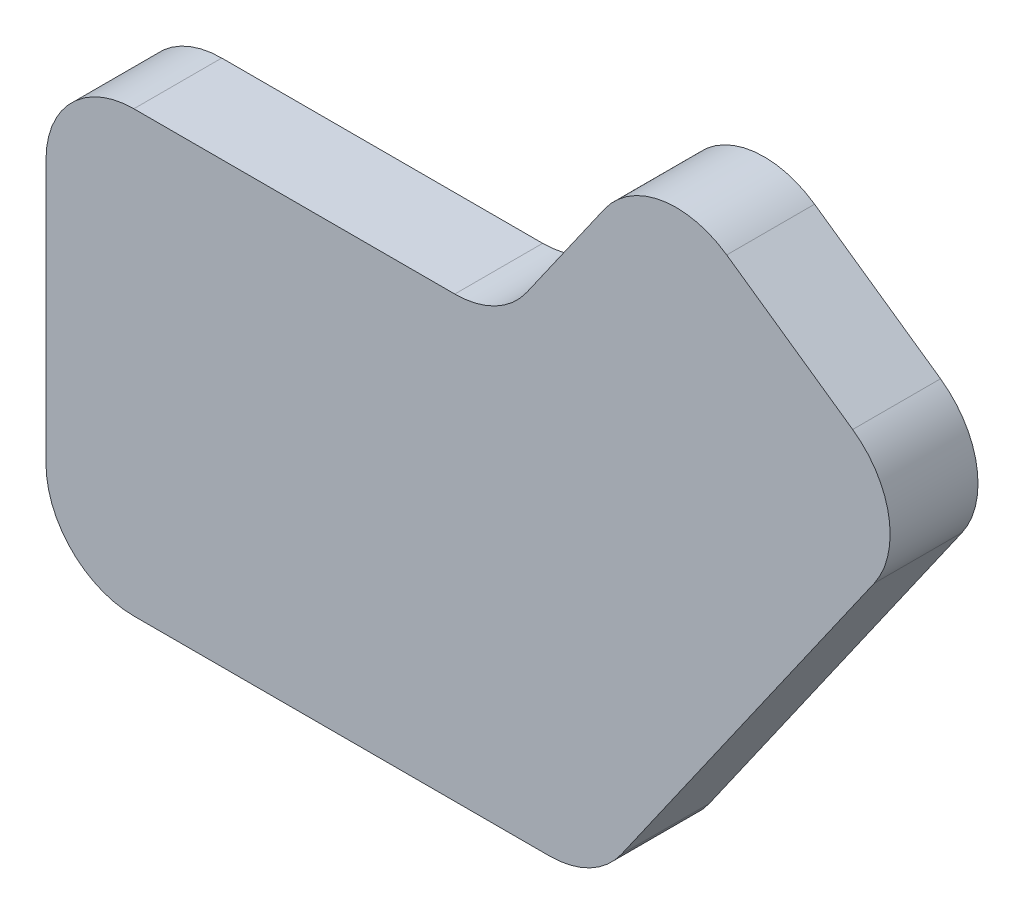
ISO-10303-21;
HEADER;
FILE_DESCRIPTION(('STEP AP214'),'2;1');
FILE_NAME('part.step','',(''),(''),'','','');
FILE_SCHEMA(('AUTOMOTIVE_DESIGN { 1 0 10303 214 1 1 1 1 }'));
ENDSEC;
DATA;
#1=APPLICATION_CONTEXT('core data for automotive mechanical design processes');
#2=APPLICATION_PROTOCOL_DEFINITION('international standard','automotive_design',2000,#1);
#3=PRODUCT_CONTEXT('',#1,'mechanical');
#4=PRODUCT('Part','Part','',(#3));
#5=PRODUCT_RELATED_PRODUCT_CATEGORY('part','',(#4));
#6=PRODUCT_DEFINITION_FORMATION('','',#4);
#7=PRODUCT_DEFINITION_CONTEXT('part definition',#1,'design');
#8=PRODUCT_DEFINITION('design','',#6,#7);
#9=PRODUCT_DEFINITION_SHAPE('','',#8);
#10=(LENGTH_UNIT() NAMED_UNIT(*) SI_UNIT(.MILLI.,.METRE.));
#11=(NAMED_UNIT(*) PLANE_ANGLE_UNIT() SI_UNIT($,.RADIAN.));
#12=(NAMED_UNIT(*) SI_UNIT($,.STERADIAN.) SOLID_ANGLE_UNIT());
#13=UNCERTAINTY_MEASURE_WITH_UNIT(LENGTH_MEASURE(1.E-05),#10,'distance_accuracy_value','');
#14=(GEOMETRIC_REPRESENTATION_CONTEXT(3) GLOBAL_UNCERTAINTY_ASSIGNED_CONTEXT((#13)) GLOBAL_UNIT_ASSIGNED_CONTEXT((#10,
#11,#12)) REPRESENTATION_CONTEXT('',''));
#15=CARTESIAN_POINT('',(0.,0.,0.));
#16=DIRECTION('',(0.,0.,1.));
#17=DIRECTION('',(1.,0.,0.));
#18=AXIS2_PLACEMENT_3D('',#15,#16,#17);
#19=CARTESIAN_POINT('',(0.,0.,20.));
#20=DIRECTION('',(-0.819152044288989,0.57357643635105,0.));
#21=DIRECTION('',(-0.57357643635105,-0.819152044288989,0.));
#22=AXIS2_PLACEMENT_3D('',#19,#20,#21);
#23=PLANE('',#22);
#24=DIRECTION('',(0.57357643635105,0.819152044288989,0.));
#25=VECTOR('',#24,1.);
#26=CARTESIAN_POINT('',(0.,0.,0.));
#27=LINE('',#26,#25);
#28=CARTESIAN_POINT('',(5.97169987474491,8.528471272979,0.));
#29=VERTEX_POINT('',#28);
#30=CARTESIAN_POINT('',(63.528471272979,90.7280596198777,0.));
#31=VERTEX_POINT('',#30);
#32=EDGE_CURVE('E210',#29,#31,#27,.T.);
#33=ORIENTED_EDGE('',*,*,#32,.T.);
#34=DIRECTION('',(0.,0.,-1.));
#35=VECTOR('',#34,1.);
#36=CARTESIAN_POINT('',(63.528471272979,90.7280596198778,20.));
#37=LINE('',#36,#35);
#38=CARTESIAN_POINT('',(63.528471272979,90.7280596198777,20.));
#39=VERTEX_POINT('',#38);
#40=EDGE_CURVE('E135',#31,#39,#37,.F.);
#41=ORIENTED_EDGE('',*,*,#40,.T.);
#42=DIRECTION('',(0.57357643635105,0.819152044288989,0.));
#43=VECTOR('',#42,1.);
#44=CARTESIAN_POINT('',(0.,0.,20.));
#45=LINE('',#44,#43);
#46=CARTESIAN_POINT('',(5.97169987474491,8.528471272979,20.));
#47=VERTEX_POINT('',#46);
#48=EDGE_CURVE('E163',#47,#39,#45,.T.);
#49=ORIENTED_EDGE('',*,*,#48,.F.);
#50=DIRECTION('',(0.,0.,-1.));
#51=VECTOR('',#50,1.);
#52=CARTESIAN_POINT('',(5.97169987474491,8.528471272979,20.));
#53=LINE('',#52,#51);
#54=EDGE_CURVE('E201',#47,#29,#53,.T.);
#55=ORIENTED_EDGE('',*,*,#54,.T.);
#56=EDGE_LOOP('',(#33,#41,#49,#55));
#57=FACE_BOUND('',#56,.T.);
#58=ADVANCED_FACE('F36',(#57),#23,.F.);
#59=CARTESIAN_POINT('',(75.,107.111100505658,20.));
#60=DIRECTION('',(-0.573576436351049,-0.81915204428899,0.));
#61=DIRECTION('',(0.81915204428899,-0.573576436351049,0.));
#62=AXIS2_PLACEMENT_3D('',#59,#60,#61);
#63=PLANE('',#62);
#64=DIRECTION('',(-0.81915204428899,0.573576436351049,0.));
#65=VECTOR('',#64,1.);
#66=CARTESIAN_POINT('',(75.,107.111100505658,0.));
#67=LINE('',#66,#65);
#68=CARTESIAN_POINT('',(58.6169591142202,118.582629232679,0.));
#69=VERTEX_POINT('',#68);
#70=CARTESIAN_POINT('',(29.9466375641056,138.657804504965,0.));
#71=VERTEX_POINT('',#70);
#72=EDGE_CURVE('E157',#69,#71,#67,.T.);
#73=ORIENTED_EDGE('',*,*,#72,.T.);
#74=DIRECTION('',(0.,0.,-1.));
#75=VECTOR('',#74,1.);
#76=CARTESIAN_POINT('',(29.9466375641056,138.657804504965,20.));
#77=LINE('',#76,#75);
#78=CARTESIAN_POINT('',(29.9466375641056,138.657804504965,20.));
#79=VERTEX_POINT('',#78);
#80=EDGE_CURVE('E51',#71,#79,#77,.F.);
#81=ORIENTED_EDGE('',*,*,#80,.T.);
#82=DIRECTION('',(-0.81915204428899,0.573576436351049,0.));
#83=VECTOR('',#82,1.);
#84=CARTESIAN_POINT('',(75.,107.111100505658,20.));
#85=LINE('',#84,#83);
#86=CARTESIAN_POINT('',(58.6169591142202,118.582629232679,20.));
#87=VERTEX_POINT('',#86);
#88=EDGE_CURVE('E216',#87,#79,#85,.T.);
#89=ORIENTED_EDGE('',*,*,#88,.F.);
#90=DIRECTION('',(0.,0.,-1.));
#91=VECTOR('',#90,1.);
#92=CARTESIAN_POINT('',(58.6169591142202,118.582629232679,20.));
#93=LINE('',#92,#91);
#94=EDGE_CURVE('E197',#87,#69,#93,.T.);
#95=ORIENTED_EDGE('',*,*,#94,.T.);
#96=EDGE_LOOP('',(#73,#81,#89,#95));
#97=FACE_BOUND('',#96,.T.);
#98=ADVANCED_FACE('F221',(#97),#63,.F.);
#99=CARTESIAN_POINT('',(13.5635966783258,150.129333231986,20.));
#100=DIRECTION('',(0.819152044288989,-0.57357643635105,0.));
#101=DIRECTION('',(0.57357643635105,0.819152044288989,0.));
#102=AXIS2_PLACEMENT_3D('',#99,#100,#101);
#103=PLANE('',#102);
#104=DIRECTION('',(-0.57357643635105,-0.819152044288989,0.));
#105=VECTOR('',#104,1.);
#106=CARTESIAN_POINT('',(13.5635966783258,150.129333231986,0.));
#107=LINE('',#106,#105);
#108=CARTESIAN_POINT('',(2.09206795130483,133.746292346206,0.));
#109=VERTEX_POINT('',#108);
#110=CARTESIAN_POINT('',(-15.5656404613929,108.528471272979,0.));
#111=VERTEX_POINT('',#110);
#112=EDGE_CURVE('E152',#109,#111,#107,.T.);
#113=ORIENTED_EDGE('',*,*,#112,.T.);
#114=DIRECTION('',(0.,0.,-1.));
#115=VECTOR('',#114,1.);
#116=CARTESIAN_POINT('',(-15.5656404613929,108.528471272979,20.));
#117=LINE('',#116,#115);
#118=CARTESIAN_POINT('',(-15.5656404613929,108.528471272979,20.));
#119=VERTEX_POINT('',#118);
#120=EDGE_CURVE('E130',#111,#119,#117,.F.);
#121=ORIENTED_EDGE('',*,*,#120,.T.);
#122=DIRECTION('',(-0.57357643635105,-0.819152044288989,0.));
#123=VECTOR('',#122,1.);
#124=CARTESIAN_POINT('',(13.5635966783258,150.129333231986,20.));
#125=LINE('',#124,#123);
#126=CARTESIAN_POINT('',(2.09206795130483,133.746292346206,20.));
#127=VERTEX_POINT('',#126);
#128=EDGE_CURVE('E228',#127,#119,#125,.T.);
#129=ORIENTED_EDGE('',*,*,#128,.F.);
#130=DIRECTION('',(0.,0.,-1.));
#131=VECTOR('',#130,1.);
#132=CARTESIAN_POINT('',(2.09206795130483,133.746292346206,20.));
#133=LINE('',#132,#131);
#134=EDGE_CURVE('E144',#127,#109,#133,.T.);
#135=ORIENTED_EDGE('',*,*,#134,.T.);
#136=EDGE_LOOP('',(#113,#121,#129,#135));
#137=FACE_BOUND('',#136,.T.);
#138=ADVANCED_FACE('F237',(#137),#103,.F.);
#139=CARTESIAN_POINT('',(-125.,100.,20.));
#140=DIRECTION('',(0.,-1.,0.));
#141=DIRECTION('',(0.,0.,-1.));
#142=AXIS2_PLACEMENT_3D('',#139,#140,#141);
#143=PLANE('',#142);
#144=DIRECTION('',(-1.,0.,0.));
#145=VECTOR('',#144,1.);
#146=CARTESIAN_POINT('',(-125.,100.,20.));
#147=LINE('',#146,#145);
#148=CARTESIAN_POINT('',(-31.9486813471727,100.,20.));
#149=VERTEX_POINT('',#148);
#150=CARTESIAN_POINT('',(-105.,100.,20.));
#151=VERTEX_POINT('',#150);
#152=EDGE_CURVE('E143',#149,#151,#147,.T.);
#153=ORIENTED_EDGE('',*,*,#152,.F.);
#154=DIRECTION('',(0.,0.,-1.));
#155=VECTOR('',#154,1.);
#156=CARTESIAN_POINT('',(-31.9486813471727,100.,0.));
#157=LINE('',#156,#155);
#158=CARTESIAN_POINT('',(-31.9486813471727,100.,0.));
#159=VERTEX_POINT('',#158);
#160=EDGE_CURVE('E129',#149,#159,#157,.T.);
#161=ORIENTED_EDGE('',*,*,#160,.T.);
#162=DIRECTION('',(-1.,0.,0.));
#163=VECTOR('',#162,1.);
#164=CARTESIAN_POINT('',(-125.,100.,0.));
#165=LINE('',#164,#163);
#166=CARTESIAN_POINT('',(-105.,100.,0.));
#167=VERTEX_POINT('',#166);
#168=EDGE_CURVE('E140',#159,#167,#165,.T.);
#169=ORIENTED_EDGE('',*,*,#168,.T.);
#170=DIRECTION('',(0.,0.,-1.));
#171=VECTOR('',#170,1.);
#172=CARTESIAN_POINT('',(-105.,100.,20.));
#173=LINE('',#172,#171);
#174=EDGE_CURVE('E145',#167,#151,#173,.F.);
#175=ORIENTED_EDGE('',*,*,#174,.T.);
#176=EDGE_LOOP('',(#153,#161,#169,#175));
#177=FACE_BOUND('',#176,.T.);
#178=ADVANCED_FACE('F139',(#177),#143,.F.);
#179=CARTESIAN_POINT('',(-125.,0.,20.));
#180=DIRECTION('',(1.,0.,0.));
#181=DIRECTION('',(0.,0.,-1.));
#182=AXIS2_PLACEMENT_3D('',#179,#180,#181);
#183=PLANE('',#182);
#184=DIRECTION('',(0.,-1.,0.));
#185=VECTOR('',#184,1.);
#186=CARTESIAN_POINT('',(-125.,0.,0.));
#187=LINE('',#186,#185);
#188=CARTESIAN_POINT('',(-125.,80.,0.));
#189=VERTEX_POINT('',#188);
#190=CARTESIAN_POINT('',(-125.,20.,0.));
#191=VERTEX_POINT('',#190);
#192=EDGE_CURVE('E151',#189,#191,#187,.T.);
#193=ORIENTED_EDGE('',*,*,#192,.T.);
#194=DIRECTION('',(0.,0.,-1.));
#195=VECTOR('',#194,1.);
#196=CARTESIAN_POINT('',(-125.,20.,20.));
#197=LINE('',#196,#195);
#198=CARTESIAN_POINT('',(-125.,20.,20.));
#199=VERTEX_POINT('',#198);
#200=EDGE_CURVE('E186',#191,#199,#197,.F.);
#201=ORIENTED_EDGE('',*,*,#200,.T.);
#202=DIRECTION('',(0.,-1.,0.));
#203=VECTOR('',#202,1.);
#204=CARTESIAN_POINT('',(-125.,0.,20.));
#205=LINE('',#204,#203);
#206=CARTESIAN_POINT('',(-125.,80.,20.));
#207=VERTEX_POINT('',#206);
#208=EDGE_CURVE('E225',#207,#199,#205,.T.);
#209=ORIENTED_EDGE('',*,*,#208,.F.);
#210=DIRECTION('',(0.,0.,-1.));
#211=VECTOR('',#210,1.);
#212=CARTESIAN_POINT('',(-125.,80.,20.));
#213=LINE('',#212,#211);
#214=EDGE_CURVE('E183',#207,#189,#213,.T.);
#215=ORIENTED_EDGE('',*,*,#214,.T.);
#216=EDGE_LOOP('',(#193,#201,#209,#215));
#217=FACE_BOUND('',#216,.T.);
#218=ADVANCED_FACE('F244',(#217),#183,.F.);
#219=CARTESIAN_POINT('',(0.,0.,20.));
#220=DIRECTION('',(0.,1.,0.));
#221=DIRECTION('',(0.,0.,1.));
#222=AXIS2_PLACEMENT_3D('',#219,#220,#221);
#223=PLANE('',#222);
#224=DIRECTION('',(1.,0.,0.));
#225=VECTOR('',#224,1.);
#226=CARTESIAN_POINT('',(0.,0.,20.));
#227=LINE('',#226,#225);
#228=CARTESIAN_POINT('',(-105.,0.,20.));
#229=VERTEX_POINT('',#228);
#230=CARTESIAN_POINT('',(-10.4113410110349,0.,20.));
#231=VERTEX_POINT('',#230);
#232=EDGE_CURVE('E164',#229,#231,#227,.T.);
#233=ORIENTED_EDGE('',*,*,#232,.F.);
#234=DIRECTION('',(0.,0.,-1.));
#235=VECTOR('',#234,1.);
#236=CARTESIAN_POINT('',(-105.,0.,20.));
#237=LINE('',#236,#235);
#238=CARTESIAN_POINT('',(-105.,0.,0.));
#239=VERTEX_POINT('',#238);
#240=EDGE_CURVE('E171',#229,#239,#237,.T.);
#241=ORIENTED_EDGE('',*,*,#240,.T.);
#242=DIRECTION('',(1.,0.,0.));
#243=VECTOR('',#242,1.);
#244=CARTESIAN_POINT('',(0.,0.,0.));
#245=LINE('',#244,#243);
#246=CARTESIAN_POINT('',(-10.4113410110349,0.,0.));
#247=VERTEX_POINT('',#246);
#248=EDGE_CURVE('E155',#239,#247,#245,.T.);
#249=ORIENTED_EDGE('',*,*,#248,.T.);
#250=DIRECTION('',(0.,0.,-1.));
#251=VECTOR('',#250,1.);
#252=CARTESIAN_POINT('',(-10.4113410110349,0.,20.));
#253=LINE('',#252,#251);
#254=EDGE_CURVE('E169',#247,#231,#253,.F.);
#255=ORIENTED_EDGE('',*,*,#254,.T.);
#256=EDGE_LOOP('',(#233,#241,#249,#255));
#257=FACE_BOUND('',#256,.T.);
#258=ADVANCED_FACE('F252',(#257),#223,.F.);
#259=CARTESIAN_POINT('',(0.,0.,20.));
#260=DIRECTION('',(0.,0.,1.));
#261=DIRECTION('',(1.,0.,0.));
#262=AXIS2_PLACEMENT_3D('',#259,#260,#261);
#263=PLANE('',#262);
#264=ORIENTED_EDGE('',*,*,#208,.T.);
#265=CARTESIAN_POINT('',(-105.,20.,20.));
#266=DIRECTION('',(0.,0.,1.));
#267=DIRECTION('',(1.,0.,0.));
#268=AXIS2_PLACEMENT_3D('',#265,#266,#267);
#269=CIRCLE('',#268,20.);
#270=EDGE_CURVE('E195',#199,#229,#269,.T.);
#271=ORIENTED_EDGE('',*,*,#270,.T.);
#272=ORIENTED_EDGE('',*,*,#232,.T.);
#273=CARTESIAN_POINT('',(-10.4113410110349,20.,20.));
#274=DIRECTION('',(0.,0.,1.));
#275=DIRECTION('',(1.,0.,0.));
#276=AXIS2_PLACEMENT_3D('',#273,#274,#275);
#277=CIRCLE('',#276,20.);
#278=EDGE_CURVE('E188',#231,#47,#277,.T.);
#279=ORIENTED_EDGE('',*,*,#278,.T.);
#280=ORIENTED_EDGE('',*,*,#48,.T.);
#281=CARTESIAN_POINT('',(47.1454303871992,102.199588346899,20.));
#282=DIRECTION('',(0.,0.,1.));
#283=DIRECTION('',(1.,0.,0.));
#284=AXIS2_PLACEMENT_3D('',#281,#282,#283);
#285=CIRCLE('',#284,20.);
#286=EDGE_CURVE('E58',#39,#87,#285,.T.);
#287=ORIENTED_EDGE('',*,*,#286,.T.);
#288=ORIENTED_EDGE('',*,*,#88,.T.);
#289=CARTESIAN_POINT('',(18.4751088370846,122.274763619185,20.));
#290=DIRECTION('',(0.,0.,1.));
#291=DIRECTION('',(1.,0.,0.));
#292=AXIS2_PLACEMENT_3D('',#289,#290,#291);
#293=CIRCLE('',#292,20.);
#294=EDGE_CURVE('E191',#79,#127,#293,.T.);
#295=ORIENTED_EDGE('',*,*,#294,.T.);
#296=ORIENTED_EDGE('',*,*,#128,.T.);
#297=CARTESIAN_POINT('',(-31.9486813471727,120.,20.));
#298=DIRECTION('',(0.,0.,1.));
#299=DIRECTION('',(1.,0.,0.));
#300=AXIS2_PLACEMENT_3D('',#297,#298,#299);
#301=CIRCLE('',#300,20.);
#302=EDGE_CURVE('E11',#119,#149,#301,.F.);
#303=ORIENTED_EDGE('',*,*,#302,.T.);
#304=ORIENTED_EDGE('',*,*,#152,.T.);
#305=CARTESIAN_POINT('',(-105.,80.,20.));
#306=DIRECTION('',(0.,0.,1.));
#307=DIRECTION('',(1.,0.,0.));
#308=AXIS2_PLACEMENT_3D('',#305,#306,#307);
#309=CIRCLE('',#308,20.);
#310=EDGE_CURVE('E193',#151,#207,#309,.T.);
#311=ORIENTED_EDGE('',*,*,#310,.T.);
#312=EDGE_LOOP('',(#264,#271,#272,#279,#280,#287,#288,#295,#296,#303,#304,#311));
#313=FACE_BOUND('',#312,.T.);
#314=ADVANCED_FACE('F213',(#313),#263,.T.);
#315=CARTESIAN_POINT('',(0.,0.,0.));
#316=DIRECTION('',(0.,0.,1.));
#317=DIRECTION('',(1.,0.,0.));
#318=AXIS2_PLACEMENT_3D('',#315,#316,#317);
#319=PLANE('',#318);
#320=ORIENTED_EDGE('',*,*,#248,.F.);
#321=CARTESIAN_POINT('',(-105.,20.,0.));
#322=DIRECTION('',(0.,0.,1.));
#323=DIRECTION('',(1.,0.,0.));
#324=AXIS2_PLACEMENT_3D('',#321,#322,#323);
#325=CIRCLE('',#324,20.);
#326=EDGE_CURVE('E181',#239,#191,#325,.F.);
#327=ORIENTED_EDGE('',*,*,#326,.T.);
#328=ORIENTED_EDGE('',*,*,#192,.F.);
#329=CARTESIAN_POINT('',(-105.,80.,0.));
#330=DIRECTION('',(0.,0.,1.));
#331=DIRECTION('',(1.,0.,0.));
#332=AXIS2_PLACEMENT_3D('',#329,#330,#331);
#333=CIRCLE('',#332,20.);
#334=EDGE_CURVE('E150',#189,#167,#333,.F.);
#335=ORIENTED_EDGE('',*,*,#334,.T.);
#336=ORIENTED_EDGE('',*,*,#168,.F.);
#337=CARTESIAN_POINT('',(-31.9486813471727,120.,0.));
#338=DIRECTION('',(0.,0.,1.));
#339=DIRECTION('',(1.,0.,0.));
#340=AXIS2_PLACEMENT_3D('',#337,#338,#339);
#341=CIRCLE('',#340,20.);
#342=EDGE_CURVE('E44',#159,#111,#341,.T.);
#343=ORIENTED_EDGE('',*,*,#342,.T.);
#344=ORIENTED_EDGE('',*,*,#112,.F.);
#345=CARTESIAN_POINT('',(18.4751088370846,122.274763619185,0.));
#346=DIRECTION('',(0.,0.,1.));
#347=DIRECTION('',(1.,0.,0.));
#348=AXIS2_PLACEMENT_3D('',#345,#346,#347);
#349=CIRCLE('',#348,20.);
#350=EDGE_CURVE('E178',#109,#71,#349,.F.);
#351=ORIENTED_EDGE('',*,*,#350,.T.);
#352=ORIENTED_EDGE('',*,*,#72,.F.);
#353=CARTESIAN_POINT('',(47.1454303871992,102.199588346899,0.));
#354=DIRECTION('',(0.,0.,1.));
#355=DIRECTION('',(1.,0.,0.));
#356=AXIS2_PLACEMENT_3D('',#353,#354,#355);
#357=CIRCLE('',#356,20.);
#358=EDGE_CURVE('E176',#69,#31,#357,.F.);
#359=ORIENTED_EDGE('',*,*,#358,.T.);
#360=ORIENTED_EDGE('',*,*,#32,.F.);
#361=CARTESIAN_POINT('',(-10.4113410110349,20.,0.));
#362=DIRECTION('',(0.,0.,1.));
#363=DIRECTION('',(1.,0.,0.));
#364=AXIS2_PLACEMENT_3D('',#361,#362,#363);
#365=CIRCLE('',#364,20.);
#366=EDGE_CURVE('E174',#29,#247,#365,.F.);
#367=ORIENTED_EDGE('',*,*,#366,.T.);
#368=EDGE_LOOP('',(#320,#327,#328,#335,#336,#343,#344,#351,#352,#359,#360,#367));
#369=FACE_BOUND('',#368,.T.);
#370=ADVANCED_FACE('F148',(#369),#319,.F.);
#371=CARTESIAN_POINT('',(-31.9486813471727,120.,20.));
#372=DIRECTION('',(0.,0.,1.));
#373=DIRECTION('',(1.,0.,0.));
#374=AXIS2_PLACEMENT_3D('',#371,#372,#373);
#375=CYLINDRICAL_SURFACE('',#374,20.);
#376=ORIENTED_EDGE('',*,*,#302,.F.);
#377=ORIENTED_EDGE('',*,*,#120,.F.);
#378=ORIENTED_EDGE('',*,*,#342,.F.);
#379=ORIENTED_EDGE('',*,*,#160,.F.);
#380=EDGE_LOOP('',(#376,#377,#378,#379));
#381=FACE_BOUND('',#380,.T.);
#382=ADVANCED_FACE('F128',(#381),#375,.F.);
#383=CARTESIAN_POINT('',(-105.,20.,20.));
#384=DIRECTION('',(0.,0.,-1.));
#385=DIRECTION('',(-1.,0.,0.));
#386=AXIS2_PLACEMENT_3D('',#383,#384,#385);
#387=CYLINDRICAL_SURFACE('',#386,20.);
#388=ORIENTED_EDGE('',*,*,#270,.F.);
#389=ORIENTED_EDGE('',*,*,#200,.F.);
#390=ORIENTED_EDGE('',*,*,#326,.F.);
#391=ORIENTED_EDGE('',*,*,#240,.F.);
#392=EDGE_LOOP('',(#388,#389,#390,#391));
#393=FACE_BOUND('',#392,.T.);
#394=ADVANCED_FACE('F249',(#393),#387,.T.);
#395=CARTESIAN_POINT('',(-105.,80.,20.));
#396=DIRECTION('',(0.,0.,-1.));
#397=DIRECTION('',(-1.,0.,0.));
#398=AXIS2_PLACEMENT_3D('',#395,#396,#397);
#399=CYLINDRICAL_SURFACE('',#398,20.);
#400=ORIENTED_EDGE('',*,*,#310,.F.);
#401=ORIENTED_EDGE('',*,*,#174,.F.);
#402=ORIENTED_EDGE('',*,*,#334,.F.);
#403=ORIENTED_EDGE('',*,*,#214,.F.);
#404=EDGE_LOOP('',(#400,#401,#402,#403));
#405=FACE_BOUND('',#404,.T.);
#406=ADVANCED_FACE('F242',(#405),#399,.T.);
#407=CARTESIAN_POINT('',(18.4751088370846,122.274763619185,20.));
#408=DIRECTION('',(0.,0.,-1.));
#409=DIRECTION('',(-1.,0.,0.));
#410=AXIS2_PLACEMENT_3D('',#407,#408,#409);
#411=CYLINDRICAL_SURFACE('',#410,20.);
#412=ORIENTED_EDGE('',*,*,#294,.F.);
#413=ORIENTED_EDGE('',*,*,#80,.F.);
#414=ORIENTED_EDGE('',*,*,#350,.F.);
#415=ORIENTED_EDGE('',*,*,#134,.F.);
#416=EDGE_LOOP('',(#412,#413,#414,#415));
#417=FACE_BOUND('',#416,.T.);
#418=ADVANCED_FACE('F235',(#417),#411,.T.);
#419=CARTESIAN_POINT('',(47.1454303871992,102.199588346899,20.));
#420=DIRECTION('',(0.,0.,-1.));
#421=DIRECTION('',(-1.,0.,0.));
#422=AXIS2_PLACEMENT_3D('',#419,#420,#421);
#423=CYLINDRICAL_SURFACE('',#422,20.);
#424=ORIENTED_EDGE('',*,*,#286,.F.);
#425=ORIENTED_EDGE('',*,*,#40,.F.);
#426=ORIENTED_EDGE('',*,*,#358,.F.);
#427=ORIENTED_EDGE('',*,*,#94,.F.);
#428=EDGE_LOOP('',(#424,#425,#426,#427));
#429=FACE_BOUND('',#428,.T.);
#430=ADVANCED_FACE('F219',(#429),#423,.T.);
#431=CARTESIAN_POINT('',(-10.4113410110349,20.,20.));
#432=DIRECTION('',(0.,0.,-1.));
#433=DIRECTION('',(-1.,0.,0.));
#434=AXIS2_PLACEMENT_3D('',#431,#432,#433);
#435=CYLINDRICAL_SURFACE('',#434,20.);
#436=ORIENTED_EDGE('',*,*,#278,.F.);
#437=ORIENTED_EDGE('',*,*,#254,.F.);
#438=ORIENTED_EDGE('',*,*,#366,.F.);
#439=ORIENTED_EDGE('',*,*,#54,.F.);
#440=EDGE_LOOP('',(#436,#437,#438,#439));
#441=FACE_BOUND('',#440,.T.);
#442=ADVANCED_FACE('F38',(#441),#435,.T.);
#443=CLOSED_SHELL('',(#58,#98,#138,#178,#218,#258,#314,#370,#382,#394,#406,#418,#430,#442));
#444=MANIFOLD_SOLID_BREP('B2',#443);
#445=ADVANCED_BREP_SHAPE_REPRESENTATION('',(#18,#444),#14);
#446=SHAPE_DEFINITION_REPRESENTATION(#9,#445);
ENDSEC;
END-ISO-10303-21;
